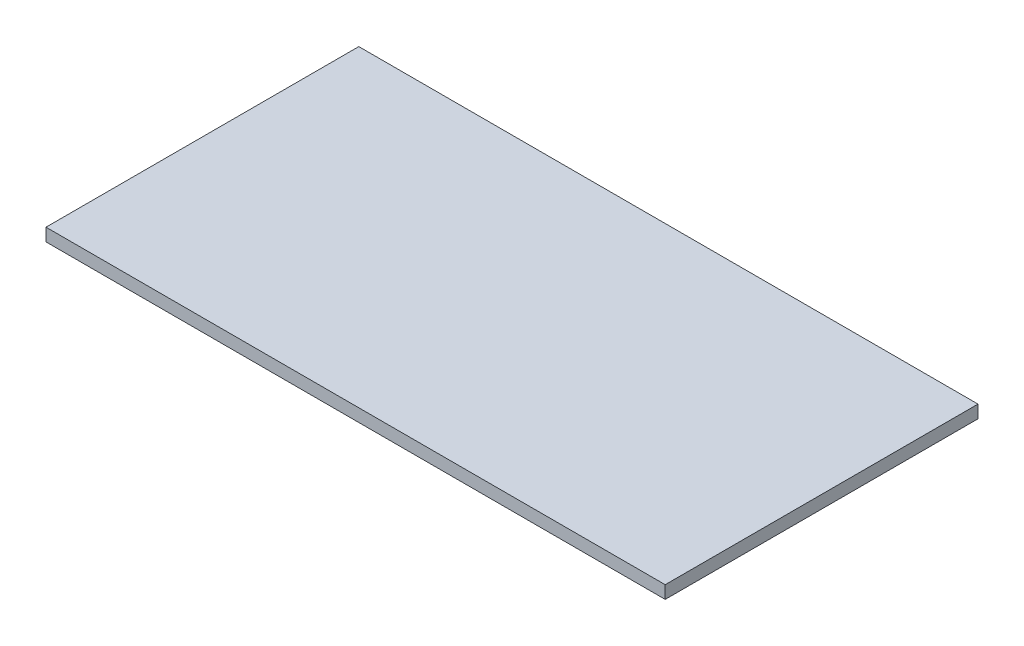
ISO-10303-21;
HEADER;
FILE_DESCRIPTION(('STEP AP214'),'2;1');
FILE_NAME('part.step','',(''),(''),'','','');
FILE_SCHEMA(('AUTOMOTIVE_DESIGN { 1 0 10303 214 1 1 1 1 }'));
ENDSEC;
DATA;
#1=APPLICATION_CONTEXT('core data for automotive mechanical design processes');
#2=APPLICATION_PROTOCOL_DEFINITION('international standard','automotive_design',2000,#1);
#3=PRODUCT_CONTEXT('',#1,'mechanical');
#4=PRODUCT('Part','Part','',(#3));
#5=PRODUCT_RELATED_PRODUCT_CATEGORY('part','',(#4));
#6=PRODUCT_DEFINITION_FORMATION('','',#4);
#7=PRODUCT_DEFINITION_CONTEXT('part definition',#1,'design');
#8=PRODUCT_DEFINITION('design','',#6,#7);
#9=PRODUCT_DEFINITION_SHAPE('','',#8);
#10=(LENGTH_UNIT() NAMED_UNIT(*) SI_UNIT(.MILLI.,.METRE.));
#11=(NAMED_UNIT(*) PLANE_ANGLE_UNIT() SI_UNIT($,.RADIAN.));
#12=(NAMED_UNIT(*) SI_UNIT($,.STERADIAN.) SOLID_ANGLE_UNIT());
#13=UNCERTAINTY_MEASURE_WITH_UNIT(LENGTH_MEASURE(1.E-05),#10,'distance_accuracy_value','');
#14=(GEOMETRIC_REPRESENTATION_CONTEXT(3) GLOBAL_UNCERTAINTY_ASSIGNED_CONTEXT((#13)) GLOBAL_UNIT_ASSIGNED_CONTEXT((#10,
#11,#12)) REPRESENTATION_CONTEXT('',''));
#15=CARTESIAN_POINT('',(0.,0.,0.));
#16=DIRECTION('',(0.,0.,1.));
#17=DIRECTION('',(1.,0.,0.));
#18=AXIS2_PLACEMENT_3D('',#15,#16,#17);
#19=CARTESIAN_POINT('',(0.,50.8,0.));
#20=DIRECTION('',(1.,0.,0.));
#21=DIRECTION('',(0.,0.,-1.));
#22=AXIS2_PLACEMENT_3D('',#19,#20,#21);
#23=PLANE('',#22);
#24=DIRECTION('',(0.,0.,1.));
#25=VECTOR('',#24,1.);
#26=CARTESIAN_POINT('',(0.,0.,0.));
#27=LINE('',#26,#25);
#28=CARTESIAN_POINT('',(0.,0.,-1244.59999999999));
#29=VERTEX_POINT('',#28);
#30=CARTESIAN_POINT('',(0.,0.,0.));
#31=VERTEX_POINT('',#30);
#32=EDGE_CURVE('E102',#29,#31,#27,.T.);
#33=ORIENTED_EDGE('',*,*,#32,.T.);
#34=DIRECTION('',(0.,-1.,0.));
#35=VECTOR('',#34,1.);
#36=CARTESIAN_POINT('',(0.,50.8,0.));
#37=LINE('',#36,#35);
#38=CARTESIAN_POINT('',(0.,50.8,0.));
#39=VERTEX_POINT('',#38);
#40=EDGE_CURVE('E11',#39,#31,#37,.T.);
#41=ORIENTED_EDGE('',*,*,#40,.F.);
#42=DIRECTION('',(0.,0.,1.));
#43=VECTOR('',#42,1.);
#44=CARTESIAN_POINT('',(0.,50.8,0.));
#45=LINE('',#44,#43);
#46=CARTESIAN_POINT('',(0.,50.8,-1244.59999999999));
#47=VERTEX_POINT('',#46);
#48=EDGE_CURVE('E90',#47,#39,#45,.T.);
#49=ORIENTED_EDGE('',*,*,#48,.F.);
#50=DIRECTION('',(0.,-1.,0.));
#51=VECTOR('',#50,1.);
#52=CARTESIAN_POINT('',(0.,50.8,-1244.59999999999));
#53=LINE('',#52,#51);
#54=EDGE_CURVE('E98',#47,#29,#53,.T.);
#55=ORIENTED_EDGE('',*,*,#54,.T.);
#56=EDGE_LOOP('',(#33,#41,#49,#55));
#57=FACE_BOUND('',#56,.T.);
#58=ADVANCED_FACE('F39',(#57),#23,.F.);
#59=CARTESIAN_POINT('',(0.,50.8,0.));
#60=DIRECTION('',(0.,0.,-1.));
#61=DIRECTION('',(-1.,0.,0.));
#62=AXIS2_PLACEMENT_3D('',#59,#60,#61);
#63=PLANE('',#62);
#64=DIRECTION('',(1.,0.,0.));
#65=VECTOR('',#64,1.);
#66=CARTESIAN_POINT('',(0.,0.,0.));
#67=LINE('',#66,#65);
#68=CARTESIAN_POINT('',(2463.8,0.,0.));
#69=VERTEX_POINT('',#68);
#70=EDGE_CURVE('E94',#31,#69,#67,.T.);
#71=ORIENTED_EDGE('',*,*,#70,.T.);
#72=DIRECTION('',(0.,-1.,0.));
#73=VECTOR('',#72,1.);
#74=CARTESIAN_POINT('',(2463.8,50.8,0.));
#75=LINE('',#74,#73);
#76=CARTESIAN_POINT('',(2463.8,50.8,0.));
#77=VERTEX_POINT('',#76);
#78=EDGE_CURVE('E47',#77,#69,#75,.T.);
#79=ORIENTED_EDGE('',*,*,#78,.F.);
#80=DIRECTION('',(1.,0.,0.));
#81=VECTOR('',#80,1.);
#82=CARTESIAN_POINT('',(0.,50.8,0.));
#83=LINE('',#82,#81);
#84=EDGE_CURVE('E85',#39,#77,#83,.T.);
#85=ORIENTED_EDGE('',*,*,#84,.F.);
#86=ORIENTED_EDGE('',*,*,#40,.T.);
#87=EDGE_LOOP('',(#71,#79,#85,#86));
#88=FACE_BOUND('',#87,.T.);
#89=ADVANCED_FACE('F93',(#88),#63,.F.);
#90=CARTESIAN_POINT('',(2463.8,50.8,0.));
#91=DIRECTION('',(-1.,0.,0.));
#92=DIRECTION('',(0.,0.,1.));
#93=AXIS2_PLACEMENT_3D('',#90,#91,#92);
#94=PLANE('',#93);
#95=DIRECTION('',(0.,0.,-1.));
#96=VECTOR('',#95,1.);
#97=CARTESIAN_POINT('',(2463.8,0.,0.));
#98=LINE('',#97,#96);
#99=CARTESIAN_POINT('',(2463.8,0.,-1244.59999999999));
#100=VERTEX_POINT('',#99);
#101=EDGE_CURVE('E72',#69,#100,#98,.T.);
#102=ORIENTED_EDGE('',*,*,#101,.T.);
#103=DIRECTION('',(0.,-1.,0.));
#104=VECTOR('',#103,1.);
#105=CARTESIAN_POINT('',(2463.8,50.8,-1244.59999999999));
#106=LINE('',#105,#104);
#107=CARTESIAN_POINT('',(2463.8,50.8,-1244.59999999999));
#108=VERTEX_POINT('',#107);
#109=EDGE_CURVE('E95',#108,#100,#106,.T.);
#110=ORIENTED_EDGE('',*,*,#109,.F.);
#111=DIRECTION('',(0.,0.,-1.));
#112=VECTOR('',#111,1.);
#113=CARTESIAN_POINT('',(2463.8,50.8,0.));
#114=LINE('',#113,#112);
#115=EDGE_CURVE('E88',#77,#108,#114,.T.);
#116=ORIENTED_EDGE('',*,*,#115,.F.);
#117=ORIENTED_EDGE('',*,*,#78,.T.);
#118=EDGE_LOOP('',(#102,#110,#116,#117));
#119=FACE_BOUND('',#118,.T.);
#120=ADVANCED_FACE('F96',(#119),#94,.F.);
#121=CARTESIAN_POINT('',(0.,50.8,-1244.59999999999));
#122=DIRECTION('',(0.,0.,1.));
#123=DIRECTION('',(1.,0.,0.));
#124=AXIS2_PLACEMENT_3D('',#121,#122,#123);
#125=PLANE('',#124);
#126=DIRECTION('',(-1.,0.,0.));
#127=VECTOR('',#126,1.);
#128=CARTESIAN_POINT('',(0.,0.,-1244.59999999999));
#129=LINE('',#128,#127);
#130=EDGE_CURVE('E78',#100,#29,#129,.T.);
#131=ORIENTED_EDGE('',*,*,#130,.T.);
#132=ORIENTED_EDGE('',*,*,#54,.F.);
#133=DIRECTION('',(-1.,0.,0.));
#134=VECTOR('',#133,1.);
#135=CARTESIAN_POINT('',(0.,50.8,-1244.59999999999));
#136=LINE('',#135,#134);
#137=EDGE_CURVE('E55',#108,#47,#136,.T.);
#138=ORIENTED_EDGE('',*,*,#137,.F.);
#139=ORIENTED_EDGE('',*,*,#109,.T.);
#140=EDGE_LOOP('',(#131,#132,#138,#139));
#141=FACE_BOUND('',#140,.T.);
#142=ADVANCED_FACE('F109',(#141),#125,.F.);
#143=CARTESIAN_POINT('',(0.,50.8,0.));
#144=DIRECTION('',(0.,-1.,0.));
#145=DIRECTION('',(0.,0.,-1.));
#146=AXIS2_PLACEMENT_3D('',#143,#144,#145);
#147=PLANE('',#146);
#148=ORIENTED_EDGE('',*,*,#48,.T.);
#149=ORIENTED_EDGE('',*,*,#84,.T.);
#150=ORIENTED_EDGE('',*,*,#115,.T.);
#151=ORIENTED_EDGE('',*,*,#137,.T.);
#152=EDGE_LOOP('',(#148,#149,#150,#151));
#153=FACE_BOUND('',#152,.T.);
#154=ADVANCED_FACE('F86',(#153),#147,.F.);
#155=CARTESIAN_POINT('',(0.,0.,0.));
#156=DIRECTION('',(0.,-1.,0.));
#157=DIRECTION('',(0.,0.,-1.));
#158=AXIS2_PLACEMENT_3D('',#155,#156,#157);
#159=PLANE('',#158);
#160=ORIENTED_EDGE('',*,*,#32,.F.);
#161=ORIENTED_EDGE('',*,*,#130,.F.);
#162=ORIENTED_EDGE('',*,*,#101,.F.);
#163=ORIENTED_EDGE('',*,*,#70,.F.);
#164=EDGE_LOOP('',(#160,#161,#162,#163));
#165=FACE_BOUND('',#164,.T.);
#166=ADVANCED_FACE('F112',(#165),#159,.T.);
#167=CLOSED_SHELL('',(#58,#89,#120,#142,#154,#166));
#168=MANIFOLD_SOLID_BREP('B2',#167);
#169=ADVANCED_BREP_SHAPE_REPRESENTATION('',(#18,#168),#14);
#170=SHAPE_DEFINITION_REPRESENTATION(#9,#169);
ENDSEC;
END-ISO-10303-21;
